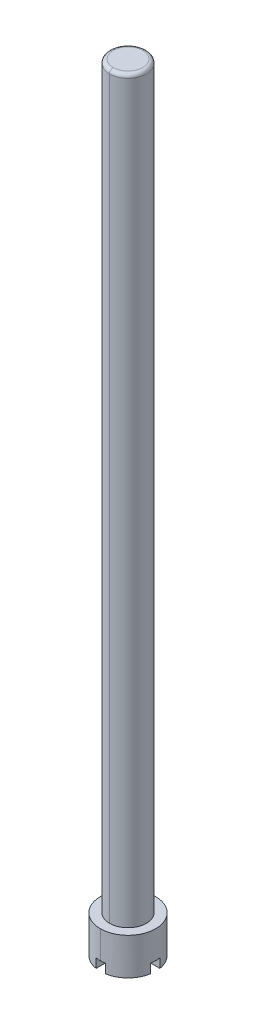
ISO-10303-21;
HEADER;
FILE_DESCRIPTION(('STEP AP214'),'2;1');
FILE_NAME('part.step','',(''),(''),'','','');
FILE_SCHEMA(('AUTOMOTIVE_DESIGN { 1 0 10303 214 1 1 1 1 }'));
ENDSEC;
DATA;
#1=APPLICATION_CONTEXT('core data for automotive mechanical design processes');
#2=APPLICATION_PROTOCOL_DEFINITION('international standard','automotive_design',2000,#1);
#3=PRODUCT_CONTEXT('',#1,'mechanical');
#4=PRODUCT('Part','Part','',(#3));
#5=PRODUCT_RELATED_PRODUCT_CATEGORY('part','',(#4));
#6=PRODUCT_DEFINITION_FORMATION('','',#4);
#7=PRODUCT_DEFINITION_CONTEXT('part definition',#1,'design');
#8=PRODUCT_DEFINITION('design','',#6,#7);
#9=PRODUCT_DEFINITION_SHAPE('','',#8);
#10=(LENGTH_UNIT() NAMED_UNIT(*) SI_UNIT(.MILLI.,.METRE.));
#11=(NAMED_UNIT(*) PLANE_ANGLE_UNIT() SI_UNIT($,.RADIAN.));
#12=(NAMED_UNIT(*) SI_UNIT($,.STERADIAN.) SOLID_ANGLE_UNIT());
#13=UNCERTAINTY_MEASURE_WITH_UNIT(LENGTH_MEASURE(1.E-05),#10,'distance_accuracy_value','');
#14=(GEOMETRIC_REPRESENTATION_CONTEXT(3) GLOBAL_UNCERTAINTY_ASSIGNED_CONTEXT((#13)) GLOBAL_UNIT_ASSIGNED_CONTEXT((#10,
#11,#12)) REPRESENTATION_CONTEXT('',''));
#15=CARTESIAN_POINT('',(0.,0.,0.));
#16=DIRECTION('',(0.,0.,1.));
#17=DIRECTION('',(1.,0.,0.));
#18=AXIS2_PLACEMENT_3D('',#15,#16,#17);
#19=CARTESIAN_POINT('',(0.,19.9,0.));
#20=DIRECTION('',(0.,1.,0.));
#21=DIRECTION('',(0.,0.,1.));
#22=AXIS2_PLACEMENT_3D('',#19,#20,#21);
#23=TOROIDAL_SURFACE('',#22,0.4,0.1);
#24=CARTESIAN_POINT('',(0.,19.9,-0.4));
#25=DIRECTION('',(1.,0.,0.));
#26=DIRECTION('',(0.,0.,-1.));
#27=AXIS2_PLACEMENT_3D('',#24,#25,#26);
#28=CIRCLE('',#27,0.1);
#29=CARTESIAN_POINT('',(0.,19.9,-0.5));
#30=VERTEX_POINT('',#29);
#31=CARTESIAN_POINT('',(0.,20.,-0.4));
#32=VERTEX_POINT('',#31);
#33=EDGE_CURVE('E261',#30,#32,#28,.T.);
#34=ORIENTED_EDGE('',*,*,#33,.F.);
#35=CARTESIAN_POINT('',(0.,19.9,0.));
#36=DIRECTION('',(0.,-1.,0.));
#37=DIRECTION('',(0.,0.,1.));
#38=AXIS2_PLACEMENT_3D('',#35,#36,#37);
#39=CIRCLE('',#38,0.5);
#40=CARTESIAN_POINT('',(0.,19.9,0.5));
#41=VERTEX_POINT('',#40);
#42=EDGE_CURVE('E234',#41,#30,#39,.T.);
#43=ORIENTED_EDGE('',*,*,#42,.F.);
#44=CARTESIAN_POINT('',(0.,19.9,0.4));
#45=DIRECTION('',(-1.,0.,0.));
#46=DIRECTION('',(0.,0.,1.));
#47=AXIS2_PLACEMENT_3D('',#44,#45,#46);
#48=CIRCLE('',#47,0.1);
#49=CARTESIAN_POINT('',(0.,20.,0.4));
#50=VERTEX_POINT('',#49);
#51=EDGE_CURVE('E260',#41,#50,#48,.T.);
#52=ORIENTED_EDGE('',*,*,#51,.T.);
#53=CARTESIAN_POINT('',(0.,20.,0.));
#54=DIRECTION('',(0.,1.,0.));
#55=DIRECTION('',(0.,0.,1.));
#56=AXIS2_PLACEMENT_3D('',#53,#54,#55);
#57=CIRCLE('',#56,0.4);
#58=EDGE_CURVE('E313',#32,#50,#57,.T.);
#59=ORIENTED_EDGE('',*,*,#58,.F.);
#60=EDGE_LOOP('',(#34,#43,#52,#59));
#61=FACE_BOUND('',#60,.T.);
#62=ADVANCED_FACE('F17',(#61),#23,.T.);
#63=CARTESIAN_POINT('',(0.,-0.659007441433451,0.));
#64=DIRECTION('',(0.,-1.,0.));
#65=DIRECTION('',(0.,0.,-1.));
#66=AXIS2_PLACEMENT_3D('',#63,#64,#65);
#67=CYLINDRICAL_SURFACE('',#66,0.25);
#68=DIRECTION('',(0.,1.,0.));
#69=VECTOR('',#68,1.);
#70=CARTESIAN_POINT('',(-0.125,-0.659007441433451,-0.21650635094611));
#71=LINE('',#70,#69);
#72=CARTESIAN_POINT('',(-0.125,-1.,-0.21650635094611));
#73=VERTEX_POINT('',#72);
#74=CARTESIAN_POINT('',(-0.125,-0.75,-0.21650635094611));
#75=VERTEX_POINT('',#74);
#76=EDGE_CURVE('E461',#73,#75,#71,.T.);
#77=ORIENTED_EDGE('',*,*,#76,.T.);
#78=CARTESIAN_POINT('',(0.,-0.75,0.));
#79=DIRECTION('',(0.,-1.,0.));
#80=DIRECTION('',(0.,0.,-1.));
#81=AXIS2_PLACEMENT_3D('',#78,#79,#80);
#82=CIRCLE('',#81,0.25);
#83=CARTESIAN_POINT('',(-0.21650635094611,-0.75,-0.125));
#84=VERTEX_POINT('',#83);
#85=EDGE_CURVE('E266',#84,#75,#82,.T.);
#86=ORIENTED_EDGE('',*,*,#85,.F.);
#87=DIRECTION('',(0.,-1.,0.));
#88=VECTOR('',#87,1.);
#89=CARTESIAN_POINT('',(-0.21650635094611,-0.659007441433451,-0.125));
#90=LINE('',#89,#88);
#91=CARTESIAN_POINT('',(-0.21650635094611,-1.,-0.125));
#92=VERTEX_POINT('',#91);
#93=EDGE_CURVE('E224',#84,#92,#90,.T.);
#94=ORIENTED_EDGE('',*,*,#93,.T.);
#95=CARTESIAN_POINT('',(0.,-1.,0.));
#96=DIRECTION('',(0.,-1.,0.));
#97=DIRECTION('',(0.,0.,-1.));
#98=AXIS2_PLACEMENT_3D('',#95,#96,#97);
#99=CIRCLE('',#98,0.25);
#100=EDGE_CURVE('E426',#92,#73,#99,.T.);
#101=ORIENTED_EDGE('',*,*,#100,.T.);
#102=EDGE_LOOP('',(#77,#86,#94,#101));
#103=FACE_BOUND('',#102,.T.);
#104=ADVANCED_FACE('F19',(#103),#67,.F.);
#105=CARTESIAN_POINT('',(0.,-0.75,0.));
#106=DIRECTION('',(0.,-1.,0.));
#107=DIRECTION('',(0.,0.,-1.));
#108=AXIS2_PLACEMENT_3D('',#105,#106,#107);
#109=CONICAL_SURFACE('',#108,0.25,1.22173047639604);
#110=DIRECTION('',(0.,-0.342020143325663,0.93969262078591));
#111=VECTOR('',#110,1.);
#112=CARTESIAN_POINT('',(0.,-0.75,0.25));
#113=LINE('',#112,#111);
#114=CARTESIAN_POINT('',(0.,-0.659007441433451,0.));
#115=VERTEX_POINT('',#114);
#116=CARTESIAN_POINT('',(0.,-0.75,0.25));
#117=VERTEX_POINT('',#116);
#118=EDGE_CURVE('E275',#115,#117,#113,.T.);
#119=ORIENTED_EDGE('',*,*,#118,.F.);
#120=DIRECTION('',(0.,-0.342020143325663,-0.93969262078591));
#121=VECTOR('',#120,1.);
#122=CARTESIAN_POINT('',(0.,-0.75,-0.25));
#123=LINE('',#122,#121);
#124=CARTESIAN_POINT('',(0.,-0.75,-0.25));
#125=VERTEX_POINT('',#124);
#126=EDGE_CURVE('E271',#115,#125,#123,.T.);
#127=ORIENTED_EDGE('',*,*,#126,.T.);
#128=CARTESIAN_POINT('',(0.,-0.75,0.));
#129=DIRECTION('',(0.,-1.,0.));
#130=DIRECTION('',(0.,0.,-1.));
#131=AXIS2_PLACEMENT_3D('',#128,#129,#130);
#132=CIRCLE('',#131,0.25);
#133=CARTESIAN_POINT('',(0.125,-0.75,-0.21650635094611));
#134=VERTEX_POINT('',#133);
#135=EDGE_CURVE('E396',#125,#134,#132,.T.);
#136=ORIENTED_EDGE('',*,*,#135,.T.);
#137=CARTESIAN_POINT('',(0.,-0.75,0.));
#138=DIRECTION('',(0.,-1.,0.));
#139=DIRECTION('',(0.,0.,-1.));
#140=AXIS2_PLACEMENT_3D('',#137,#138,#139);
#141=CIRCLE('',#140,0.25);
#142=CARTESIAN_POINT('',(0.21650635094611,-0.75,-0.125));
#143=VERTEX_POINT('',#142);
#144=EDGE_CURVE('E11',#134,#143,#141,.T.);
#145=ORIENTED_EDGE('',*,*,#144,.T.);
#146=CARTESIAN_POINT('',(0.,-0.75,0.));
#147=DIRECTION('',(0.,-1.,0.));
#148=DIRECTION('',(0.,0.,-1.));
#149=AXIS2_PLACEMENT_3D('',#146,#147,#148);
#150=CIRCLE('',#149,0.25);
#151=CARTESIAN_POINT('',(0.21650635094611,-0.75,0.125));
#152=VERTEX_POINT('',#151);
#153=EDGE_CURVE('E328',#143,#152,#150,.T.);
#154=ORIENTED_EDGE('',*,*,#153,.T.);
#155=CARTESIAN_POINT('',(0.,-0.75,0.));
#156=DIRECTION('',(0.,-1.,0.));
#157=DIRECTION('',(0.,0.,-1.));
#158=AXIS2_PLACEMENT_3D('',#155,#156,#157);
#159=CIRCLE('',#158,0.25);
#160=CARTESIAN_POINT('',(0.125,-0.75,0.21650635094611));
#161=VERTEX_POINT('',#160);
#162=EDGE_CURVE('E26',#152,#161,#159,.T.);
#163=ORIENTED_EDGE('',*,*,#162,.T.);
#164=CARTESIAN_POINT('',(0.,-0.75,0.));
#165=DIRECTION('',(0.,-1.,0.));
#166=DIRECTION('',(0.,0.,-1.));
#167=AXIS2_PLACEMENT_3D('',#164,#165,#166);
#168=CIRCLE('',#167,0.25);
#169=EDGE_CURVE('E351',#161,#117,#168,.T.);
#170=ORIENTED_EDGE('',*,*,#169,.T.);
#171=EDGE_LOOP('',(#119,#127,#136,#145,#154,#163,#170));
#172=FACE_BOUND('',#171,.T.);
#173=ADVANCED_FACE('F473',(#172),#109,.F.);
#174=CARTESIAN_POINT('',(0.,-0.659007441433451,0.));
#175=DIRECTION('',(0.,-1.,0.));
#176=DIRECTION('',(0.,0.,-1.));
#177=AXIS2_PLACEMENT_3D('',#174,#175,#176);
#178=CYLINDRICAL_SURFACE('',#177,0.25);
#179=DIRECTION('',(0.,1.,0.));
#180=VECTOR('',#179,1.);
#181=CARTESIAN_POINT('',(0.21650635094611,-0.659007441433451,-0.125));
#182=LINE('',#181,#180);
#183=CARTESIAN_POINT('',(0.21650635094611,-1.,-0.125));
#184=VERTEX_POINT('',#183);
#185=EDGE_CURVE('E455',#184,#143,#182,.T.);
#186=ORIENTED_EDGE('',*,*,#185,.T.);
#187=ORIENTED_EDGE('',*,*,#144,.F.);
#188=DIRECTION('',(0.,1.,0.));
#189=VECTOR('',#188,1.);
#190=CARTESIAN_POINT('',(0.125,-0.659007441433451,-0.21650635094611));
#191=LINE('',#190,#189);
#192=CARTESIAN_POINT('',(0.125,-1.,-0.21650635094611));
#193=VERTEX_POINT('',#192);
#194=EDGE_CURVE('E464',#193,#134,#191,.T.);
#195=ORIENTED_EDGE('',*,*,#194,.F.);
#196=CARTESIAN_POINT('',(0.,-1.,0.));
#197=DIRECTION('',(0.,-1.,0.));
#198=DIRECTION('',(0.,0.,-1.));
#199=AXIS2_PLACEMENT_3D('',#196,#197,#198);
#200=CIRCLE('',#199,0.25);
#201=EDGE_CURVE('E414',#193,#184,#200,.T.);
#202=ORIENTED_EDGE('',*,*,#201,.T.);
#203=EDGE_LOOP('',(#186,#187,#195,#202));
#204=FACE_BOUND('',#203,.T.);
#205=ADVANCED_FACE('F511',(#204),#178,.F.);
#206=CARTESIAN_POINT('',(0.,-0.659007441433451,0.));
#207=DIRECTION('',(0.,-1.,0.));
#208=DIRECTION('',(0.,0.,-1.));
#209=AXIS2_PLACEMENT_3D('',#206,#207,#208);
#210=CYLINDRICAL_SURFACE('',#209,0.25);
#211=DIRECTION('',(0.,-1.,0.));
#212=VECTOR('',#211,1.);
#213=CARTESIAN_POINT('',(-0.125,-0.659007441433451,0.21650635094611));
#214=LINE('',#213,#212);
#215=CARTESIAN_POINT('',(-0.125,-0.75,0.21650635094611));
#216=VERTEX_POINT('',#215);
#217=CARTESIAN_POINT('',(-0.125,-1.,0.21650635094611));
#218=VERTEX_POINT('',#217);
#219=EDGE_CURVE('E238',#216,#218,#214,.T.);
#220=ORIENTED_EDGE('',*,*,#219,.T.);
#221=CARTESIAN_POINT('',(0.,-1.,0.));
#222=DIRECTION('',(0.,-1.,0.));
#223=DIRECTION('',(0.,0.,-1.));
#224=AXIS2_PLACEMENT_3D('',#221,#222,#223);
#225=CIRCLE('',#224,0.25);
#226=CARTESIAN_POINT('',(-0.21650635094611,-1.,0.125));
#227=VERTEX_POINT('',#226);
#228=EDGE_CURVE('E229',#218,#227,#225,.T.);
#229=ORIENTED_EDGE('',*,*,#228,.T.);
#230=DIRECTION('',(0.,-1.,0.));
#231=VECTOR('',#230,1.);
#232=CARTESIAN_POINT('',(-0.21650635094611,-0.659007441433451,0.125));
#233=LINE('',#232,#231);
#234=CARTESIAN_POINT('',(-0.21650635094611,-0.75,0.125));
#235=VERTEX_POINT('',#234);
#236=EDGE_CURVE('E212',#235,#227,#233,.T.);
#237=ORIENTED_EDGE('',*,*,#236,.F.);
#238=CARTESIAN_POINT('',(0.,-0.75,0.));
#239=DIRECTION('',(0.,-1.,0.));
#240=DIRECTION('',(0.,0.,-1.));
#241=AXIS2_PLACEMENT_3D('',#238,#239,#240);
#242=CIRCLE('',#241,0.25);
#243=EDGE_CURVE('E267',#216,#235,#242,.T.);
#244=ORIENTED_EDGE('',*,*,#243,.F.);
#245=EDGE_LOOP('',(#220,#229,#237,#244));
#246=FACE_BOUND('',#245,.T.);
#247=ADVANCED_FACE('F237',(#246),#210,.F.);
#248=CARTESIAN_POINT('',(0.,-0.659007441433451,0.));
#249=DIRECTION('',(0.,-1.,0.));
#250=DIRECTION('',(0.,0.,-1.));
#251=AXIS2_PLACEMENT_3D('',#248,#249,#250);
#252=CYLINDRICAL_SURFACE('',#251,0.25);
#253=ORIENTED_EDGE('',*,*,#162,.F.);
#254=DIRECTION('',(0.,1.,0.));
#255=VECTOR('',#254,1.);
#256=CARTESIAN_POINT('',(0.21650635094611,-0.659007441433451,0.125));
#257=LINE('',#256,#255);
#258=CARTESIAN_POINT('',(0.21650635094611,-1.,0.125));
#259=VERTEX_POINT('',#258);
#260=EDGE_CURVE('E448',#259,#152,#257,.T.);
#261=ORIENTED_EDGE('',*,*,#260,.F.);
#262=CARTESIAN_POINT('',(0.,-1.,0.));
#263=DIRECTION('',(0.,-1.,0.));
#264=DIRECTION('',(0.,0.,-1.));
#265=AXIS2_PLACEMENT_3D('',#262,#263,#264);
#266=CIRCLE('',#265,0.25);
#267=CARTESIAN_POINT('',(0.125,-1.,0.21650635094611));
#268=VERTEX_POINT('',#267);
#269=EDGE_CURVE('E316',#259,#268,#266,.T.);
#270=ORIENTED_EDGE('',*,*,#269,.T.);
#271=DIRECTION('',(0.,-1.,0.));
#272=VECTOR('',#271,1.);
#273=CARTESIAN_POINT('',(0.125,-0.659007441433451,0.21650635094611));
#274=LINE('',#273,#272);
#275=EDGE_CURVE('E51',#161,#268,#274,.T.);
#276=ORIENTED_EDGE('',*,*,#275,.F.);
#277=EDGE_LOOP('',(#253,#261,#270,#276));
#278=FACE_BOUND('',#277,.T.);
#279=ADVANCED_FACE('F479',(#278),#252,.F.);
#280=CARTESIAN_POINT('',(-0.125,-0.75,0.125));
#281=DIRECTION('',(0.,0.,1.));
#282=DIRECTION('',(1.,0.,0.));
#283=AXIS2_PLACEMENT_3D('',#280,#281,#282);
#284=PLANE('',#283);
#285=DIRECTION('',(-1.,0.,0.));
#286=VECTOR('',#285,1.);
#287=CARTESIAN_POINT('',(-0.125,-0.75,0.125));
#288=LINE('',#287,#286);
#289=CARTESIAN_POINT('',(-0.739509972887452,-0.75,0.125));
#290=VERTEX_POINT('',#289);
#291=EDGE_CURVE('E218',#235,#290,#288,.T.);
#292=ORIENTED_EDGE('',*,*,#291,.F.);
#293=ORIENTED_EDGE('',*,*,#236,.T.);
#294=DIRECTION('',(-1.,0.,0.));
#295=VECTOR('',#294,1.);
#296=CARTESIAN_POINT('',(-0.125,-1.,0.125));
#297=LINE('',#296,#295);
#298=CARTESIAN_POINT('',(-0.739509972887452,-1.,0.125));
#299=VERTEX_POINT('',#298);
#300=EDGE_CURVE('E215',#227,#299,#297,.T.);
#301=ORIENTED_EDGE('',*,*,#300,.T.);
#302=DIRECTION('',(0.,-1.,0.));
#303=VECTOR('',#302,1.);
#304=CARTESIAN_POINT('',(-0.739509972887452,-1.,0.125));
#305=LINE('',#304,#303);
#306=EDGE_CURVE('E360',#290,#299,#305,.T.);
#307=ORIENTED_EDGE('',*,*,#306,.F.);
#308=EDGE_LOOP('',(#292,#293,#301,#307));
#309=FACE_BOUND('',#308,.T.);
#310=ADVANCED_FACE('F214',(#309),#284,.F.);
#311=CARTESIAN_POINT('',(-0.125,-0.75,-0.125));
#312=DIRECTION('',(0.,0.,1.));
#313=DIRECTION('',(1.,0.,0.));
#314=AXIS2_PLACEMENT_3D('',#311,#312,#313);
#315=PLANE('',#314);
#316=ORIENTED_EDGE('',*,*,#93,.F.);
#317=DIRECTION('',(-1.,0.,0.));
#318=VECTOR('',#317,1.);
#319=CARTESIAN_POINT('',(-0.125,-0.75,-0.125));
#320=LINE('',#319,#318);
#321=CARTESIAN_POINT('',(-0.739509972887452,-0.75,-0.125));
#322=VERTEX_POINT('',#321);
#323=EDGE_CURVE('E389',#84,#322,#320,.T.);
#324=ORIENTED_EDGE('',*,*,#323,.T.);
#325=DIRECTION('',(0.,-1.,0.));
#326=VECTOR('',#325,1.);
#327=CARTESIAN_POINT('',(-0.739509972887452,-1.,-0.125));
#328=LINE('',#327,#326);
#329=CARTESIAN_POINT('',(-0.739509972887452,-1.,-0.125));
#330=VERTEX_POINT('',#329);
#331=EDGE_CURVE('E356',#322,#330,#328,.T.);
#332=ORIENTED_EDGE('',*,*,#331,.T.);
#333=DIRECTION('',(-1.,0.,0.));
#334=VECTOR('',#333,1.);
#335=CARTESIAN_POINT('',(-0.125,-1.,-0.125));
#336=LINE('',#335,#334);
#337=EDGE_CURVE('E250',#92,#330,#336,.T.);
#338=ORIENTED_EDGE('',*,*,#337,.F.);
#339=EDGE_LOOP('',(#316,#324,#332,#338));
#340=FACE_BOUND('',#339,.T.);
#341=ADVANCED_FACE('F854',(#340),#315,.T.);
#342=CARTESIAN_POINT('',(-0.125,-0.75,-0.835149175207411));
#343=DIRECTION('',(1.,0.,0.));
#344=DIRECTION('',(0.,0.,1.));
#345=AXIS2_PLACEMENT_3D('',#342,#343,#344);
#346=PLANE('',#345);
#347=ORIENTED_EDGE('',*,*,#76,.F.);
#348=DIRECTION('',(0.,0.,1.));
#349=VECTOR('',#348,1.);
#350=CARTESIAN_POINT('',(-0.125,-1.,0.));
#351=LINE('',#350,#349);
#352=CARTESIAN_POINT('',(-0.125,-1.,-0.739509972887452));
#353=VERTEX_POINT('',#352);
#354=EDGE_CURVE('E241',#353,#73,#351,.T.);
#355=ORIENTED_EDGE('',*,*,#354,.F.);
#356=DIRECTION('',(0.,1.,0.));
#357=VECTOR('',#356,1.);
#358=CARTESIAN_POINT('',(-0.125,-1.,-0.739509972887452));
#359=LINE('',#358,#357);
#360=CARTESIAN_POINT('',(-0.125,-0.75,-0.739509972887452));
#361=VERTEX_POINT('',#360);
#362=EDGE_CURVE('E399',#353,#361,#359,.T.);
#363=ORIENTED_EDGE('',*,*,#362,.T.);
#364=DIRECTION('',(0.,0.,1.));
#365=VECTOR('',#364,1.);
#366=CARTESIAN_POINT('',(-0.125,-0.75,-0.835149175207411));
#367=LINE('',#366,#365);
#368=EDGE_CURVE('E441',#361,#75,#367,.T.);
#369=ORIENTED_EDGE('',*,*,#368,.T.);
#370=EDGE_LOOP('',(#347,#355,#363,#369));
#371=FACE_BOUND('',#370,.T.);
#372=ADVANCED_FACE('F865',(#371),#346,.T.);
#373=CARTESIAN_POINT('',(0.125,-0.75,-0.835149175207411));
#374=DIRECTION('',(1.,0.,0.));
#375=DIRECTION('',(0.,0.,1.));
#376=AXIS2_PLACEMENT_3D('',#373,#374,#375);
#377=PLANE('',#376);
#378=DIRECTION('',(0.,0.,1.));
#379=VECTOR('',#378,1.);
#380=CARTESIAN_POINT('',(0.125,-1.,0.));
#381=LINE('',#380,#379);
#382=CARTESIAN_POINT('',(0.125,-1.,-0.739509972887452));
#383=VERTEX_POINT('',#382);
#384=EDGE_CURVE('E418',#383,#193,#381,.T.);
#385=ORIENTED_EDGE('',*,*,#384,.T.);
#386=ORIENTED_EDGE('',*,*,#194,.T.);
#387=DIRECTION('',(0.,0.,1.));
#388=VECTOR('',#387,1.);
#389=CARTESIAN_POINT('',(0.125,-0.75,-0.835149175207411));
#390=LINE('',#389,#388);
#391=CARTESIAN_POINT('',(0.125,-0.75,-0.739509972887452));
#392=VERTEX_POINT('',#391);
#393=EDGE_CURVE('E437',#392,#134,#390,.T.);
#394=ORIENTED_EDGE('',*,*,#393,.F.);
#395=DIRECTION('',(0.,1.,0.));
#396=VECTOR('',#395,1.);
#397=CARTESIAN_POINT('',(0.125,-1.,-0.739509972887452));
#398=LINE('',#397,#396);
#399=EDGE_CURVE('E365',#383,#392,#398,.T.);
#400=ORIENTED_EDGE('',*,*,#399,.F.);
#401=EDGE_LOOP('',(#385,#386,#394,#400));
#402=FACE_BOUND('',#401,.T.);
#403=ADVANCED_FACE('F500',(#402),#377,.F.);
#404=CARTESIAN_POINT('',(0.87546783339079,-0.75,-0.125));
#405=DIRECTION('',(0.,0.,1.));
#406=DIRECTION('',(1.,0.,0.));
#407=AXIS2_PLACEMENT_3D('',#404,#405,#406);
#408=PLANE('',#407);
#409=ORIENTED_EDGE('',*,*,#185,.F.);
#410=DIRECTION('',(-1.,0.,0.));
#411=VECTOR('',#410,1.);
#412=CARTESIAN_POINT('',(0.,-1.,-0.125));
#413=LINE('',#412,#411);
#414=CARTESIAN_POINT('',(0.739509972887452,-1.,-0.125));
#415=VERTEX_POINT('',#414);
#416=EDGE_CURVE('E422',#415,#184,#413,.T.);
#417=ORIENTED_EDGE('',*,*,#416,.F.);
#418=DIRECTION('',(0.,1.,0.));
#419=VECTOR('',#418,1.);
#420=CARTESIAN_POINT('',(0.739509972887452,-1.,-0.125));
#421=LINE('',#420,#419);
#422=CARTESIAN_POINT('',(0.739509972887452,-0.75,-0.125));
#423=VERTEX_POINT('',#422);
#424=EDGE_CURVE('E348',#415,#423,#421,.T.);
#425=ORIENTED_EDGE('',*,*,#424,.T.);
#426=DIRECTION('',(-1.,0.,0.));
#427=VECTOR('',#426,1.);
#428=CARTESIAN_POINT('',(0.87546783339079,-0.75,-0.125));
#429=LINE('',#428,#427);
#430=EDGE_CURVE('E323',#423,#143,#429,.T.);
#431=ORIENTED_EDGE('',*,*,#430,.T.);
#432=EDGE_LOOP('',(#409,#417,#425,#431));
#433=FACE_BOUND('',#432,.T.);
#434=ADVANCED_FACE('F513',(#433),#408,.T.);
#435=CARTESIAN_POINT('',(0.87546783339079,-0.75,0.125));
#436=DIRECTION('',(0.,0.,1.));
#437=DIRECTION('',(1.,0.,0.));
#438=AXIS2_PLACEMENT_3D('',#435,#436,#437);
#439=PLANE('',#438);
#440=DIRECTION('',(-1.,0.,0.));
#441=VECTOR('',#440,1.);
#442=CARTESIAN_POINT('',(0.,-1.,0.125));
#443=LINE('',#442,#441);
#444=CARTESIAN_POINT('',(0.739509972887452,-1.,0.125));
#445=VERTEX_POINT('',#444);
#446=EDGE_CURVE('E445',#445,#259,#443,.T.);
#447=ORIENTED_EDGE('',*,*,#446,.T.);
#448=ORIENTED_EDGE('',*,*,#260,.T.);
#449=DIRECTION('',(-1.,0.,0.));
#450=VECTOR('',#449,1.);
#451=CARTESIAN_POINT('',(0.87546783339079,-0.75,0.125));
#452=LINE('',#451,#450);
#453=CARTESIAN_POINT('',(0.739509972887452,-0.75,0.125));
#454=VERTEX_POINT('',#453);
#455=EDGE_CURVE('E327',#454,#152,#452,.T.);
#456=ORIENTED_EDGE('',*,*,#455,.F.);
#457=DIRECTION('',(0.,1.,0.));
#458=VECTOR('',#457,1.);
#459=CARTESIAN_POINT('',(0.739509972887452,-1.,0.125));
#460=LINE('',#459,#458);
#461=EDGE_CURVE('E340',#445,#454,#460,.T.);
#462=ORIENTED_EDGE('',*,*,#461,.F.);
#463=EDGE_LOOP('',(#447,#448,#456,#462));
#464=FACE_BOUND('',#463,.T.);
#465=ADVANCED_FACE('F519',(#464),#439,.F.);
#466=CARTESIAN_POINT('',(0.125,-0.75,0.125));
#467=DIRECTION('',(1.,0.,0.));
#468=DIRECTION('',(0.,0.,-1.));
#469=AXIS2_PLACEMENT_3D('',#466,#467,#468);
#470=PLANE('',#469);
#471=DIRECTION('',(0.,0.,1.));
#472=VECTOR('',#471,1.);
#473=CARTESIAN_POINT('',(0.125,-0.75,0.125));
#474=LINE('',#473,#472);
#475=CARTESIAN_POINT('',(0.125,-0.75,0.739509972887452));
#476=VERTEX_POINT('',#475);
#477=EDGE_CURVE('E281',#161,#476,#474,.T.);
#478=ORIENTED_EDGE('',*,*,#477,.F.);
#479=ORIENTED_EDGE('',*,*,#275,.T.);
#480=DIRECTION('',(0.,0.,1.));
#481=VECTOR('',#480,1.);
#482=CARTESIAN_POINT('',(0.125,-1.,0.125));
#483=LINE('',#482,#481);
#484=CARTESIAN_POINT('',(0.125,-1.,0.739509972887452));
#485=VERTEX_POINT('',#484);
#486=EDGE_CURVE('E442',#268,#485,#483,.T.);
#487=ORIENTED_EDGE('',*,*,#486,.T.);
#488=DIRECTION('',(0.,-1.,0.));
#489=VECTOR('',#488,1.);
#490=CARTESIAN_POINT('',(0.125,-1.,0.739509972887452));
#491=LINE('',#490,#489);
#492=EDGE_CURVE('E332',#476,#485,#491,.T.);
#493=ORIENTED_EDGE('',*,*,#492,.F.);
#494=EDGE_LOOP('',(#478,#479,#487,#493));
#495=FACE_BOUND('',#494,.T.);
#496=ADVANCED_FACE('F482',(#495),#470,.F.);
#497=CARTESIAN_POINT('',(-0.125,-0.75,0.125));
#498=DIRECTION('',(1.,0.,0.));
#499=DIRECTION('',(0.,1.,0.));
#500=AXIS2_PLACEMENT_3D('',#497,#498,#499);
#501=PLANE('',#500);
#502=ORIENTED_EDGE('',*,*,#219,.F.);
#503=DIRECTION('',(0.,0.,1.));
#504=VECTOR('',#503,1.);
#505=CARTESIAN_POINT('',(-0.125,-0.75,0.125));
#506=LINE('',#505,#504);
#507=CARTESIAN_POINT('',(-0.125,-0.75,0.739509972887452));
#508=VERTEX_POINT('',#507);
#509=EDGE_CURVE('E280',#216,#508,#506,.T.);
#510=ORIENTED_EDGE('',*,*,#509,.T.);
#511=DIRECTION('',(0.,-1.,0.));
#512=VECTOR('',#511,1.);
#513=CARTESIAN_POINT('',(-0.125,-1.,0.739509972887452));
#514=LINE('',#513,#512);
#515=CARTESIAN_POINT('',(-0.125,-1.,0.739509972887452));
#516=VERTEX_POINT('',#515);
#517=EDGE_CURVE('E368',#508,#516,#514,.T.);
#518=ORIENTED_EDGE('',*,*,#517,.T.);
#519=DIRECTION('',(0.,0.,1.));
#520=VECTOR('',#519,1.);
#521=CARTESIAN_POINT('',(-0.125,-1.,0.125));
#522=LINE('',#521,#520);
#523=EDGE_CURVE('E235',#218,#516,#522,.T.);
#524=ORIENTED_EDGE('',*,*,#523,.F.);
#525=EDGE_LOOP('',(#502,#510,#518,#524));
#526=FACE_BOUND('',#525,.T.);
#527=ADVANCED_FACE('F660',(#526),#501,.T.);
#528=CARTESIAN_POINT('',(0.,-0.75,0.));
#529=DIRECTION('',(0.,-1.,0.));
#530=DIRECTION('',(0.,0.,-1.));
#531=AXIS2_PLACEMENT_3D('',#528,#529,#530);
#532=PLANE('',#531);
#533=CARTESIAN_POINT('',(0.,-0.75,0.));
#534=DIRECTION('',(0.,-1.,0.));
#535=DIRECTION('',(0.,0.,-1.));
#536=AXIS2_PLACEMENT_3D('',#533,#534,#535);
#537=CIRCLE('',#536,0.25);
#538=EDGE_CURVE('E298',#75,#125,#537,.T.);
#539=ORIENTED_EDGE('',*,*,#538,.F.);
#540=ORIENTED_EDGE('',*,*,#368,.F.);
#541=CARTESIAN_POINT('',(0.,-0.75,0.));
#542=DIRECTION('',(0.,-1.,0.));
#543=DIRECTION('',(0.,0.,-1.));
#544=AXIS2_PLACEMENT_3D('',#541,#542,#543);
#545=CIRCLE('',#544,0.75);
#546=CARTESIAN_POINT('',(0.,-0.75,-0.75));
#547=VERTEX_POINT('',#546);
#548=EDGE_CURVE('E393',#361,#547,#545,.T.);
#549=ORIENTED_EDGE('',*,*,#548,.T.);
#550=CARTESIAN_POINT('',(0.,-0.75,0.));
#551=DIRECTION('',(0.,-1.,0.));
#552=DIRECTION('',(0.,0.,-1.));
#553=AXIS2_PLACEMENT_3D('',#550,#551,#552);
#554=CIRCLE('',#553,0.75);
#555=EDGE_CURVE('E291',#547,#392,#554,.T.);
#556=ORIENTED_EDGE('',*,*,#555,.T.);
#557=ORIENTED_EDGE('',*,*,#393,.T.);
#558=ORIENTED_EDGE('',*,*,#135,.F.);
#559=EDGE_LOOP('',(#539,#540,#549,#556,#557,#558));
#560=FACE_BOUND('',#559,.T.);
#561=ADVANCED_FACE('F496',(#560),#532,.T.);
#562=CARTESIAN_POINT('',(0.,0.,0.));
#563=DIRECTION('',(0.,-1.,0.));
#564=DIRECTION('',(0.,0.,-1.));
#565=AXIS2_PLACEMENT_3D('',#562,#563,#564);
#566=PLANE('',#565);
#567=CARTESIAN_POINT('',(0.,0.,0.));
#568=DIRECTION('',(0.,1.,0.));
#569=DIRECTION('',(0.,0.,1.));
#570=AXIS2_PLACEMENT_3D('',#567,#568,#569);
#571=CIRCLE('',#570,0.5);
#572=CARTESIAN_POINT('',(0.,0.,-0.5));
#573=VERTEX_POINT('',#572);
#574=CARTESIAN_POINT('',(0.,0.,0.5));
#575=VERTEX_POINT('',#574);
#576=EDGE_CURVE('E317',#573,#575,#571,.T.);
#577=ORIENTED_EDGE('',*,*,#576,.F.);
#578=CARTESIAN_POINT('',(0.,0.,0.));
#579=DIRECTION('',(0.,1.,0.));
#580=DIRECTION('',(0.,0.,1.));
#581=AXIS2_PLACEMENT_3D('',#578,#579,#580);
#582=CIRCLE('',#581,0.5);
#583=EDGE_CURVE('E254',#575,#573,#582,.T.);
#584=ORIENTED_EDGE('',*,*,#583,.F.);
#585=EDGE_LOOP('',(#577,#584));
#586=FACE_BOUND('',#585,.T.);
#587=CARTESIAN_POINT('',(0.,0.,0.));
#588=DIRECTION('',(0.,-1.,0.));
#589=DIRECTION('',(0.,0.,-1.));
#590=AXIS2_PLACEMENT_3D('',#587,#588,#589);
#591=CIRCLE('',#590,0.75);
#592=CARTESIAN_POINT('',(0.,0.,0.75));
#593=VERTEX_POINT('',#592);
#594=CARTESIAN_POINT('',(0.,0.,-0.75));
#595=VERTEX_POINT('',#594);
#596=EDGE_CURVE('E411',#593,#595,#591,.T.);
#597=ORIENTED_EDGE('',*,*,#596,.F.);
#598=CARTESIAN_POINT('',(0.,0.,0.));
#599=DIRECTION('',(0.,-1.,0.));
#600=DIRECTION('',(0.,0.,-1.));
#601=AXIS2_PLACEMENT_3D('',#598,#599,#600);
#602=CIRCLE('',#601,0.75);
#603=EDGE_CURVE('E290',#595,#593,#602,.T.);
#604=ORIENTED_EDGE('',*,*,#603,.F.);
#605=EDGE_LOOP('',(#597,#604));
#606=FACE_BOUND('',#605,.T.);
#607=ADVANCED_FACE('F545',(#586,#606),#566,.F.);
#608=CARTESIAN_POINT('',(0.,-1.,0.));
#609=DIRECTION('',(0.,-1.,0.));
#610=DIRECTION('',(0.,0.,-1.));
#611=AXIS2_PLACEMENT_3D('',#608,#609,#610);
#612=PLANE('',#611);
#613=ORIENTED_EDGE('',*,*,#269,.F.);
#614=ORIENTED_EDGE('',*,*,#446,.F.);
#615=CARTESIAN_POINT('',(0.,-1.,0.));
#616=DIRECTION('',(0.,-1.,0.));
#617=DIRECTION('',(0.,0.,-1.));
#618=AXIS2_PLACEMENT_3D('',#615,#616,#617);
#619=CIRCLE('',#618,0.75);
#620=EDGE_CURVE('E336',#445,#485,#619,.T.);
#621=ORIENTED_EDGE('',*,*,#620,.T.);
#622=ORIENTED_EDGE('',*,*,#486,.F.);
#623=EDGE_LOOP('',(#613,#614,#621,#622));
#624=FACE_BOUND('',#623,.T.);
#625=ADVANCED_FACE('F525',(#624),#612,.T.);
#626=CARTESIAN_POINT('',(0.,20.,0.));
#627=DIRECTION('',(0.,1.,0.));
#628=DIRECTION('',(1.,0.,0.));
#629=AXIS2_PLACEMENT_3D('',#626,#627,#628);
#630=PLANE('',#629);
#631=CARTESIAN_POINT('',(0.,20.,0.));
#632=DIRECTION('',(0.,1.,0.));
#633=DIRECTION('',(0.,0.,1.));
#634=AXIS2_PLACEMENT_3D('',#631,#632,#633);
#635=CIRCLE('',#634,0.4);
#636=EDGE_CURVE('E256',#50,#32,#635,.T.);
#637=ORIENTED_EDGE('',*,*,#636,.T.);
#638=ORIENTED_EDGE('',*,*,#58,.T.);
#639=EDGE_LOOP('',(#637,#638));
#640=FACE_BOUND('',#639,.T.);
#641=ADVANCED_FACE('F571',(#640),#630,.T.);
#642=CARTESIAN_POINT('',(0.,20.,0.));
#643=DIRECTION('',(0.,-1.,0.));
#644=DIRECTION('',(0.,0.,-1.));
#645=AXIS2_PLACEMENT_3D('',#642,#643,#644);
#646=CYLINDRICAL_SURFACE('',#645,0.5);
#647=DIRECTION('',(0.,-1.,0.));
#648=VECTOR('',#647,1.);
#649=CARTESIAN_POINT('',(0.,20.,0.5));
#650=LINE('',#649,#648);
#651=EDGE_CURVE('E302',#41,#575,#650,.T.);
#652=ORIENTED_EDGE('',*,*,#651,.F.);
#653=ORIENTED_EDGE('',*,*,#42,.T.);
#654=DIRECTION('',(0.,-1.,0.));
#655=VECTOR('',#654,1.);
#656=CARTESIAN_POINT('',(0.,20.,-0.5));
#657=LINE('',#656,#655);
#658=EDGE_CURVE('E306',#30,#573,#657,.T.);
#659=ORIENTED_EDGE('',*,*,#658,.T.);
#660=ORIENTED_EDGE('',*,*,#576,.T.);
#661=EDGE_LOOP('',(#652,#653,#659,#660));
#662=FACE_BOUND('',#661,.T.);
#663=ADVANCED_FACE('F558',(#662),#646,.T.);
#664=CARTESIAN_POINT('',(0.,-1.,0.));
#665=DIRECTION('',(0.,-1.,0.));
#666=DIRECTION('',(0.,0.,-1.));
#667=AXIS2_PLACEMENT_3D('',#664,#665,#666);
#668=PLANE('',#667);
#669=ORIENTED_EDGE('',*,*,#228,.F.);
#670=ORIENTED_EDGE('',*,*,#523,.T.);
#671=CARTESIAN_POINT('',(0.,-1.,0.));
#672=DIRECTION('',(0.,-1.,0.));
#673=DIRECTION('',(0.,0.,-1.));
#674=AXIS2_PLACEMENT_3D('',#671,#672,#673);
#675=CIRCLE('',#674,0.75);
#676=EDGE_CURVE('E231',#516,#299,#675,.T.);
#677=ORIENTED_EDGE('',*,*,#676,.T.);
#678=ORIENTED_EDGE('',*,*,#300,.F.);
#679=EDGE_LOOP('',(#669,#670,#677,#678));
#680=FACE_BOUND('',#679,.T.);
#681=ADVANCED_FACE('F228',(#680),#668,.T.);
#682=CARTESIAN_POINT('',(0.,-1.,0.));
#683=DIRECTION('',(0.,-1.,0.));
#684=DIRECTION('',(0.,0.,-1.));
#685=AXIS2_PLACEMENT_3D('',#682,#683,#684);
#686=PLANE('',#685);
#687=ORIENTED_EDGE('',*,*,#100,.F.);
#688=ORIENTED_EDGE('',*,*,#337,.T.);
#689=CARTESIAN_POINT('',(0.,-1.,0.));
#690=DIRECTION('',(0.,-1.,0.));
#691=DIRECTION('',(0.,0.,-1.));
#692=AXIS2_PLACEMENT_3D('',#689,#690,#691);
#693=CIRCLE('',#692,0.75);
#694=EDGE_CURVE('E361',#330,#353,#693,.T.);
#695=ORIENTED_EDGE('',*,*,#694,.T.);
#696=ORIENTED_EDGE('',*,*,#354,.T.);
#697=EDGE_LOOP('',(#687,#688,#695,#696));
#698=FACE_BOUND('',#697,.T.);
#699=ADVANCED_FACE('F729',(#698),#686,.T.);
#700=CARTESIAN_POINT('',(0.,-1.,0.));
#701=DIRECTION('',(0.,-1.,0.));
#702=DIRECTION('',(0.,0.,-1.));
#703=AXIS2_PLACEMENT_3D('',#700,#701,#702);
#704=PLANE('',#703);
#705=ORIENTED_EDGE('',*,*,#201,.F.);
#706=ORIENTED_EDGE('',*,*,#384,.F.);
#707=CARTESIAN_POINT('',(0.,-1.,0.));
#708=DIRECTION('',(0.,-1.,0.));
#709=DIRECTION('',(0.,0.,-1.));
#710=AXIS2_PLACEMENT_3D('',#707,#708,#709);
#711=CIRCLE('',#710,0.75);
#712=EDGE_CURVE('E355',#383,#415,#711,.T.);
#713=ORIENTED_EDGE('',*,*,#712,.T.);
#714=ORIENTED_EDGE('',*,*,#416,.T.);
#715=EDGE_LOOP('',(#705,#706,#713,#714));
#716=FACE_BOUND('',#715,.T.);
#717=ADVANCED_FACE('F510',(#716),#704,.T.);
#718=CARTESIAN_POINT('',(0.,-1.,0.));
#719=DIRECTION('',(0.,1.,0.));
#720=DIRECTION('',(0.,0.,1.));
#721=AXIS2_PLACEMENT_3D('',#718,#719,#720);
#722=CYLINDRICAL_SURFACE('',#721,0.75);
#723=DIRECTION('',(0.,1.,0.));
#724=VECTOR('',#723,1.);
#725=CARTESIAN_POINT('',(0.,-1.,-0.75));
#726=LINE('',#725,#724);
#727=EDGE_CURVE('E286',#547,#595,#726,.T.);
#728=ORIENTED_EDGE('',*,*,#727,.F.);
#729=ORIENTED_EDGE('',*,*,#548,.F.);
#730=ORIENTED_EDGE('',*,*,#362,.F.);
#731=ORIENTED_EDGE('',*,*,#694,.F.);
#732=ORIENTED_EDGE('',*,*,#331,.F.);
#733=CARTESIAN_POINT('',(0.,-0.75,0.));
#734=DIRECTION('',(0.,-1.,0.));
#735=DIRECTION('',(0.,0.,-1.));
#736=AXIS2_PLACEMENT_3D('',#733,#734,#735);
#737=CIRCLE('',#736,0.75);
#738=EDGE_CURVE('E385',#290,#322,#737,.T.);
#739=ORIENTED_EDGE('',*,*,#738,.F.);
#740=ORIENTED_EDGE('',*,*,#306,.T.);
#741=ORIENTED_EDGE('',*,*,#676,.F.);
#742=ORIENTED_EDGE('',*,*,#517,.F.);
#743=CARTESIAN_POINT('',(0.,-0.75,0.));
#744=DIRECTION('',(0.,-1.,0.));
#745=DIRECTION('',(0.,0.,-1.));
#746=AXIS2_PLACEMENT_3D('',#743,#744,#745);
#747=CIRCLE('',#746,0.75);
#748=CARTESIAN_POINT('',(0.,-0.75,0.75));
#749=VERTEX_POINT('',#748);
#750=EDGE_CURVE('E276',#749,#508,#747,.T.);
#751=ORIENTED_EDGE('',*,*,#750,.F.);
#752=DIRECTION('',(0.,1.,0.));
#753=VECTOR('',#752,1.);
#754=CARTESIAN_POINT('',(0.,-1.,0.75));
#755=LINE('',#754,#753);
#756=EDGE_CURVE('E318',#749,#593,#755,.T.);
#757=ORIENTED_EDGE('',*,*,#756,.T.);
#758=ORIENTED_EDGE('',*,*,#596,.T.);
#759=EDGE_LOOP('',(#728,#729,#730,#731,#732,#739,#740,#741,#742,#751,#757,#758));
#760=FACE_BOUND('',#759,.T.);
#761=ADVANCED_FACE('F547',(#760),#722,.T.);
#762=CARTESIAN_POINT('',(0.,-0.75,0.));
#763=DIRECTION('',(0.,-1.,0.));
#764=DIRECTION('',(0.,0.,-1.));
#765=AXIS2_PLACEMENT_3D('',#762,#763,#764);
#766=PLANE('',#765);
#767=CARTESIAN_POINT('',(0.,-0.75,0.));
#768=DIRECTION('',(0.,-1.,0.));
#769=DIRECTION('',(0.,0.,-1.));
#770=AXIS2_PLACEMENT_3D('',#767,#768,#769);
#771=CIRCLE('',#770,0.25);
#772=EDGE_CURVE('E262',#235,#84,#771,.T.);
#773=ORIENTED_EDGE('',*,*,#772,.F.);
#774=ORIENTED_EDGE('',*,*,#291,.T.);
#775=ORIENTED_EDGE('',*,*,#738,.T.);
#776=ORIENTED_EDGE('',*,*,#323,.F.);
#777=EDGE_LOOP('',(#773,#774,#775,#776));
#778=FACE_BOUND('',#777,.T.);
#779=ADVANCED_FACE('F594',(#778),#766,.T.);
#780=CARTESIAN_POINT('',(0.,-0.75,0.));
#781=DIRECTION('',(0.,-1.,0.));
#782=DIRECTION('',(0.,0.,-1.));
#783=AXIS2_PLACEMENT_3D('',#780,#781,#782);
#784=PLANE('',#783);
#785=ORIENTED_EDGE('',*,*,#169,.F.);
#786=ORIENTED_EDGE('',*,*,#477,.T.);
#787=CARTESIAN_POINT('',(0.,-0.75,0.));
#788=DIRECTION('',(0.,-1.,0.));
#789=DIRECTION('',(0.,0.,-1.));
#790=AXIS2_PLACEMENT_3D('',#787,#788,#789);
#791=CIRCLE('',#790,0.75);
#792=EDGE_CURVE('E322',#476,#749,#791,.T.);
#793=ORIENTED_EDGE('',*,*,#792,.T.);
#794=ORIENTED_EDGE('',*,*,#750,.T.);
#795=ORIENTED_EDGE('',*,*,#509,.F.);
#796=CARTESIAN_POINT('',(0.,-0.75,0.));
#797=DIRECTION('',(0.,-1.,0.));
#798=DIRECTION('',(0.,0.,-1.));
#799=AXIS2_PLACEMENT_3D('',#796,#797,#798);
#800=CIRCLE('',#799,0.25);
#801=EDGE_CURVE('E285',#117,#216,#800,.T.);
#802=ORIENTED_EDGE('',*,*,#801,.F.);
#803=EDGE_LOOP('',(#785,#786,#793,#794,#795,#802));
#804=FACE_BOUND('',#803,.T.);
#805=ADVANCED_FACE('F485',(#804),#784,.T.);
#806=CARTESIAN_POINT('',(0.,-0.75,0.));
#807=DIRECTION('',(0.,-1.,0.));
#808=DIRECTION('',(0.,0.,-1.));
#809=AXIS2_PLACEMENT_3D('',#806,#807,#808);
#810=PLANE('',#809);
#811=ORIENTED_EDGE('',*,*,#153,.F.);
#812=ORIENTED_EDGE('',*,*,#430,.F.);
#813=CARTESIAN_POINT('',(0.,-0.75,0.));
#814=DIRECTION('',(0.,-1.,0.));
#815=DIRECTION('',(0.,0.,-1.));
#816=AXIS2_PLACEMENT_3D('',#813,#814,#815);
#817=CIRCLE('',#816,0.75);
#818=EDGE_CURVE('E344',#423,#454,#817,.T.);
#819=ORIENTED_EDGE('',*,*,#818,.T.);
#820=ORIENTED_EDGE('',*,*,#455,.T.);
#821=EDGE_LOOP('',(#811,#812,#819,#820));
#822=FACE_BOUND('',#821,.T.);
#823=ADVANCED_FACE('F515',(#822),#810,.T.);
#824=CARTESIAN_POINT('',(0.,-1.,0.));
#825=DIRECTION('',(0.,1.,0.));
#826=DIRECTION('',(0.,0.,1.));
#827=AXIS2_PLACEMENT_3D('',#824,#825,#826);
#828=CYLINDRICAL_SURFACE('',#827,0.75);
#829=ORIENTED_EDGE('',*,*,#555,.F.);
#830=ORIENTED_EDGE('',*,*,#727,.T.);
#831=ORIENTED_EDGE('',*,*,#603,.T.);
#832=ORIENTED_EDGE('',*,*,#756,.F.);
#833=ORIENTED_EDGE('',*,*,#792,.F.);
#834=ORIENTED_EDGE('',*,*,#492,.T.);
#835=ORIENTED_EDGE('',*,*,#620,.F.);
#836=ORIENTED_EDGE('',*,*,#461,.T.);
#837=ORIENTED_EDGE('',*,*,#818,.F.);
#838=ORIENTED_EDGE('',*,*,#424,.F.);
#839=ORIENTED_EDGE('',*,*,#712,.F.);
#840=ORIENTED_EDGE('',*,*,#399,.T.);
#841=EDGE_LOOP('',(#829,#830,#831,#832,#833,#834,#835,#836,#837,#838,#839,#840));
#842=FACE_BOUND('',#841,.T.);
#843=ADVANCED_FACE('F505',(#842),#828,.T.);
#844=CARTESIAN_POINT('',(0.,20.,0.));
#845=DIRECTION('',(0.,-1.,0.));
#846=DIRECTION('',(0.,0.,-1.));
#847=AXIS2_PLACEMENT_3D('',#844,#845,#846);
#848=CYLINDRICAL_SURFACE('',#847,0.5);
#849=CARTESIAN_POINT('',(0.,19.9,0.));
#850=DIRECTION('',(0.,-1.,0.));
#851=DIRECTION('',(0.,0.,1.));
#852=AXIS2_PLACEMENT_3D('',#849,#850,#851);
#853=CIRCLE('',#852,0.5);
#854=EDGE_CURVE('E531',#30,#41,#853,.T.);
#855=ORIENTED_EDGE('',*,*,#854,.T.);
#856=ORIENTED_EDGE('',*,*,#651,.T.);
#857=ORIENTED_EDGE('',*,*,#583,.T.);
#858=ORIENTED_EDGE('',*,*,#658,.F.);
#859=EDGE_LOOP('',(#855,#856,#857,#858));
#860=FACE_BOUND('',#859,.T.);
#861=ADVANCED_FACE('F564',(#860),#848,.T.);
#862=CARTESIAN_POINT('',(0.,-0.75,0.));
#863=DIRECTION('',(0.,-1.,0.));
#864=DIRECTION('',(0.,0.,-1.));
#865=AXIS2_PLACEMENT_3D('',#862,#863,#864);
#866=CONICAL_SURFACE('',#865,0.25,1.22173047639604);
#867=ORIENTED_EDGE('',*,*,#126,.F.);
#868=ORIENTED_EDGE('',*,*,#118,.T.);
#869=ORIENTED_EDGE('',*,*,#801,.T.);
#870=ORIENTED_EDGE('',*,*,#243,.T.);
#871=ORIENTED_EDGE('',*,*,#772,.T.);
#872=ORIENTED_EDGE('',*,*,#85,.T.);
#873=ORIENTED_EDGE('',*,*,#538,.T.);
#874=EDGE_LOOP('',(#867,#868,#869,#870,#871,#872,#873));
#875=FACE_BOUND('',#874,.T.);
#876=ADVANCED_FACE('F492',(#875),#866,.F.);
#877=CARTESIAN_POINT('',(0.,19.9,0.));
#878=DIRECTION('',(0.,1.,0.));
#879=DIRECTION('',(0.,0.,1.));
#880=AXIS2_PLACEMENT_3D('',#877,#878,#879);
#881=TOROIDAL_SURFACE('',#880,0.4,0.1);
#882=ORIENTED_EDGE('',*,*,#854,.F.);
#883=ORIENTED_EDGE('',*,*,#33,.T.);
#884=ORIENTED_EDGE('',*,*,#636,.F.);
#885=ORIENTED_EDGE('',*,*,#51,.F.);
#886=EDGE_LOOP('',(#882,#883,#884,#885));
#887=FACE_BOUND('',#886,.T.);
#888=ADVANCED_FACE('F569',(#887),#881,.T.);
#889=CLOSED_SHELL('',(#62,#104,#173,#205,#247,#279,#310,#341,#372,#403,#434,#465,#496,#527,#561,
#607,#625,#641,#663,#681,#699,#717,#761,#779,#805,#823,#843,#861,#876,#888));
#890=MANIFOLD_SOLID_BREP('B1',#889);
#891=ADVANCED_BREP_SHAPE_REPRESENTATION('',(#18,#890),#14);
#892=SHAPE_DEFINITION_REPRESENTATION(#9,#891);
ENDSEC;
END-ISO-10303-21;
